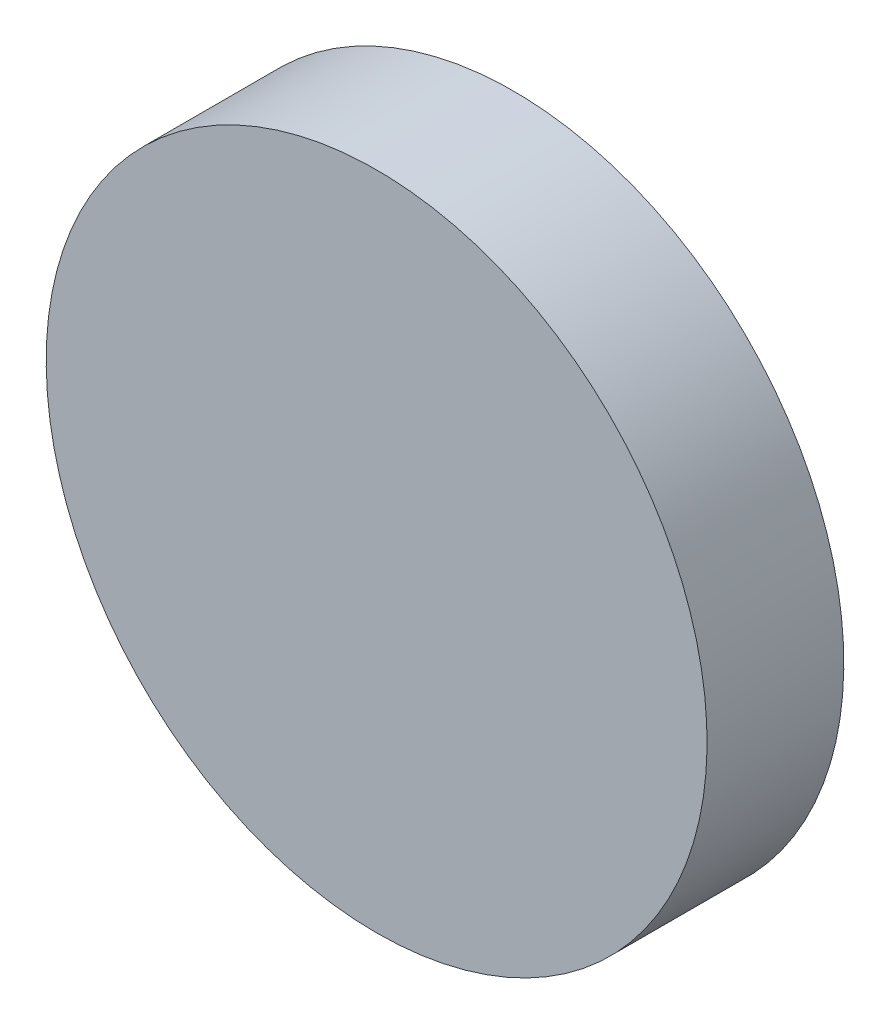
ISO-10303-21;
HEADER;
FILE_DESCRIPTION(('STEP AP214'),'2;1');
FILE_NAME('part.step','',(''),(''),'','','');
FILE_SCHEMA(('AUTOMOTIVE_DESIGN { 1 0 10303 214 1 1 1 1 }'));
ENDSEC;
DATA;
#1=APPLICATION_CONTEXT('core data for automotive mechanical design processes');
#2=APPLICATION_PROTOCOL_DEFINITION('international standard','automotive_design',2000,#1);
#3=PRODUCT_CONTEXT('',#1,'mechanical');
#4=PRODUCT('Part','Part','',(#3));
#5=PRODUCT_RELATED_PRODUCT_CATEGORY('part','',(#4));
#6=PRODUCT_DEFINITION_FORMATION('','',#4);
#7=PRODUCT_DEFINITION_CONTEXT('part definition',#1,'design');
#8=PRODUCT_DEFINITION('design','',#6,#7);
#9=PRODUCT_DEFINITION_SHAPE('','',#8);
#10=(LENGTH_UNIT() NAMED_UNIT(*) SI_UNIT(.MILLI.,.METRE.));
#11=(NAMED_UNIT(*) PLANE_ANGLE_UNIT() SI_UNIT($,.RADIAN.));
#12=(NAMED_UNIT(*) SI_UNIT($,.STERADIAN.) SOLID_ANGLE_UNIT());
#13=UNCERTAINTY_MEASURE_WITH_UNIT(LENGTH_MEASURE(1.E-05),#10,'distance_accuracy_value','');
#14=(GEOMETRIC_REPRESENTATION_CONTEXT(3) GLOBAL_UNCERTAINTY_ASSIGNED_CONTEXT((#13)) GLOBAL_UNIT_ASSIGNED_CONTEXT((#10,
#11,#12)) REPRESENTATION_CONTEXT('',''));
#15=CARTESIAN_POINT('',(0.,0.,0.));
#16=DIRECTION('',(0.,0.,1.));
#17=DIRECTION('',(1.,0.,0.));
#18=AXIS2_PLACEMENT_3D('',#15,#16,#17);
#19=CARTESIAN_POINT('',(0.,0.,10.63));
#20=DIRECTION('',(0.,0.,-1.));
#21=DIRECTION('',(0.,1.,0.));
#22=AXIS2_PLACEMENT_3D('',#19,#20,#21);
#23=PLANE('',#22);
#24=CARTESIAN_POINT('',(0.,0.,10.63));
#25=DIRECTION('',(0.,0.,1.));
#26=DIRECTION('',(0.,-1.,0.));
#27=AXIS2_PLACEMENT_3D('',#24,#25,#26);
#28=CIRCLE('',#27,14.5);
#29=CARTESIAN_POINT('',(0.,-14.5,10.63));
#30=VERTEX_POINT('',#29);
#31=EDGE_CURVE('E17',#30,#30,#28,.T.);
#32=ORIENTED_EDGE('',*,*,#31,.F.);
#33=EDGE_LOOP('',(#32));
#34=FACE_BOUND('',#33,.T.);
#35=ADVANCED_FACE('F14',(#34),#23,.T.);
#36=CARTESIAN_POINT('',(0.,0.,16.63));
#37=DIRECTION('',(0.,0.,1.));
#38=DIRECTION('',(0.,-1.,0.));
#39=AXIS2_PLACEMENT_3D('',#36,#37,#38);
#40=CYLINDRICAL_SURFACE('',#39,14.5);
#41=ORIENTED_EDGE('',*,*,#31,.T.);
#42=EDGE_LOOP('',(#41));
#43=FACE_BOUND('',#42,.T.);
#44=CARTESIAN_POINT('',(0.,0.,16.63));
#45=DIRECTION('',(0.,0.,1.));
#46=DIRECTION('',(0.,-1.,0.));
#47=AXIS2_PLACEMENT_3D('',#44,#45,#46);
#48=CIRCLE('',#47,14.5);
#49=CARTESIAN_POINT('',(0.,-14.5,16.63));
#50=VERTEX_POINT('',#49);
#51=EDGE_CURVE('E10',#50,#50,#48,.T.);
#52=ORIENTED_EDGE('',*,*,#51,.F.);
#53=EDGE_LOOP('',(#52));
#54=FACE_BOUND('',#53,.T.);
#55=ADVANCED_FACE('F26',(#43,#54),#40,.T.);
#56=CARTESIAN_POINT('',(0.,0.,16.63));
#57=DIRECTION('',(0.,0.,1.));
#58=DIRECTION('',(0.,-1.,0.));
#59=AXIS2_PLACEMENT_3D('',#56,#57,#58);
#60=PLANE('',#59);
#61=ORIENTED_EDGE('',*,*,#51,.T.);
#62=EDGE_LOOP('',(#61));
#63=FACE_BOUND('',#62,.T.);
#64=ADVANCED_FACE('F34',(#63),#60,.T.);
#65=CLOSED_SHELL('',(#35,#55,#64));
#66=MANIFOLD_SOLID_BREP('B1',#65);
#67=ADVANCED_BREP_SHAPE_REPRESENTATION('',(#18,#66),#14);
#68=SHAPE_DEFINITION_REPRESENTATION(#9,#67);
ENDSEC;
END-ISO-10303-21;
